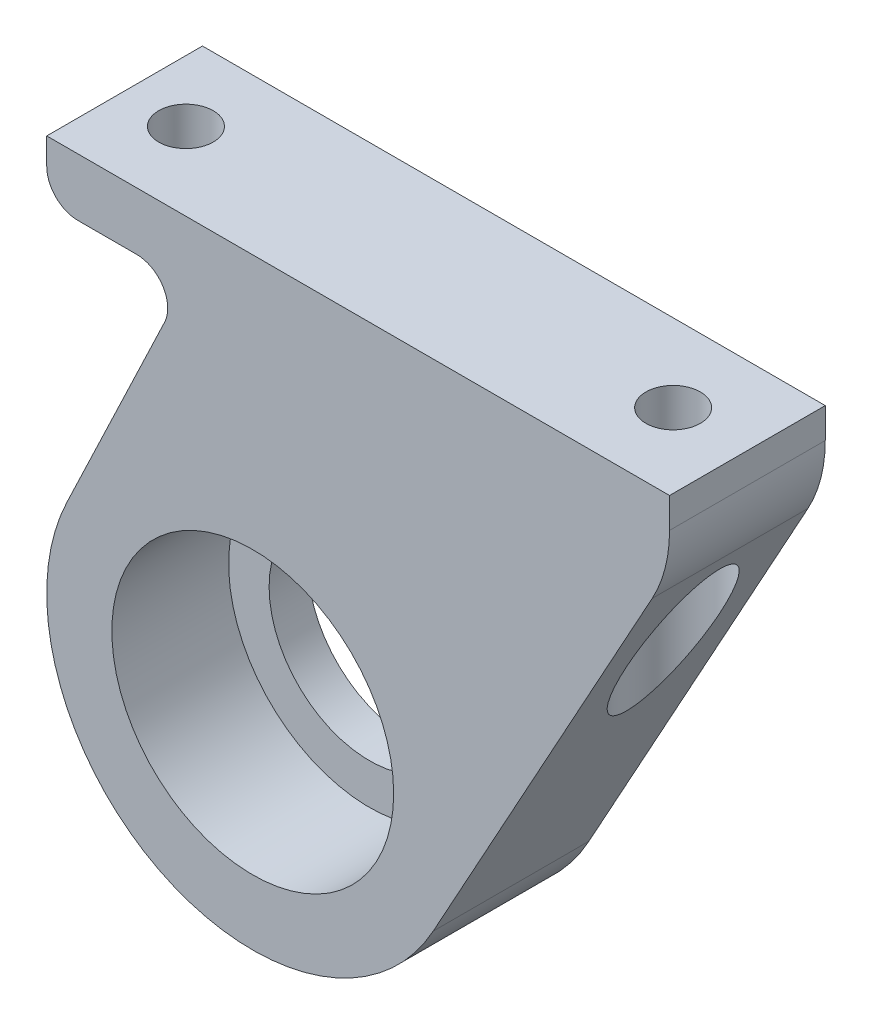
ISO-10303-21;
HEADER;
FILE_DESCRIPTION(('STEP AP214'),'2;1');
FILE_NAME('part.step','',(''),(''),'','','');
FILE_SCHEMA(('AUTOMOTIVE_DESIGN { 1 0 10303 214 1 1 1 1 }'));
ENDSEC;
DATA;
#1=APPLICATION_CONTEXT('core data for automotive mechanical design processes');
#2=APPLICATION_PROTOCOL_DEFINITION('international standard','automotive_design',2000,#1);
#3=PRODUCT_CONTEXT('',#1,'mechanical');
#4=PRODUCT('Part','Part','',(#3));
#5=PRODUCT_RELATED_PRODUCT_CATEGORY('part','',(#4));
#6=PRODUCT_DEFINITION_FORMATION('','',#4);
#7=PRODUCT_DEFINITION_CONTEXT('part definition',#1,'design');
#8=PRODUCT_DEFINITION('design','',#6,#7);
#9=PRODUCT_DEFINITION_SHAPE('','',#8);
#10=(LENGTH_UNIT() NAMED_UNIT(*) SI_UNIT(.MILLI.,.METRE.));
#11=(NAMED_UNIT(*) PLANE_ANGLE_UNIT() SI_UNIT($,.RADIAN.));
#12=(NAMED_UNIT(*) SI_UNIT($,.STERADIAN.) SOLID_ANGLE_UNIT());
#13=UNCERTAINTY_MEASURE_WITH_UNIT(LENGTH_MEASURE(1.E-05),#10,'distance_accuracy_value','');
#14=(GEOMETRIC_REPRESENTATION_CONTEXT(3) GLOBAL_UNCERTAINTY_ASSIGNED_CONTEXT((#13)) GLOBAL_UNIT_ASSIGNED_CONTEXT((#10,
#11,#12)) REPRESENTATION_CONTEXT('',''));
#15=CARTESIAN_POINT('',(0.,0.,0.));
#16=DIRECTION('',(0.,0.,1.));
#17=DIRECTION('',(1.,0.,0.));
#18=AXIS2_PLACEMENT_3D('',#15,#16,#17);
#19=CARTESIAN_POINT('',(-20.423245911174,18.3245528808047,10.));
#20=DIRECTION('',(0.,0.,1.));
#21=DIRECTION('',(-1.,0.,0.));
#22=AXIS2_PLACEMENT_3D('',#19,#20,#21);
#23=CYLINDRICAL_SURFACE('',#22,2.);
#24=CARTESIAN_POINT('',(-20.4232459111739,16.3245528808047,12.7127607788059));
#25=CARTESIAN_POINT('',(-20.4887695492939,16.3245611442696,12.7683597231879));
#26=CARTESIAN_POINT('',(-20.551782925905,16.3277700807168,12.8266988335914));
#27=CARTESIAN_POINT('',(-20.6722658688388,16.3391942056474,12.9481927882589));
#28=CARTESIAN_POINT('',(-20.7297457982924,16.3473998163829,13.0113382175279));
#29=CARTESIAN_POINT('',(-20.8929254544888,16.3773502421294,13.2066801127024));
#30=CARTESIAN_POINT('',(-20.990019498793,16.404456252849,13.3453421223078));
#31=CARTESIAN_POINT('',(-21.1493133231444,16.4593263762254,13.6189108915641));
#32=CARTESIAN_POINT('',(-21.2142721504513,16.4866392343981,13.752345741235));
#33=CARTESIAN_POINT('',(-21.3240672508794,16.5378766477722,14.0281588711045));
#34=CARTESIAN_POINT('',(-21.3688910002988,16.5617990878733,14.1705426548211));
#35=CARTESIAN_POINT('',(-21.422374733152,16.5918592511803,14.398908707465));
#36=CARTESIAN_POINT('',(-21.4382973581837,16.601221299669,14.4828205669503));
#37=CARTESIAN_POINT('',(-21.4629547439993,16.6159811711615,14.6520671201811));
#38=CARTESIAN_POINT('',(-21.4716895825385,16.6213790370486,14.7374017985248));
#39=CARTESIAN_POINT('',(-21.4818035637808,16.6276465166273,14.9085526407736));
#40=CARTESIAN_POINT('',(-21.4831929708175,16.6285224491222,14.9943679649659));
#41=CARTESIAN_POINT('',(-21.4786189332838,16.6256722751133,15.1657191879824));
#42=CARTESIAN_POINT('',(-21.4726561490108,16.6219465818797,15.2512551112077));
#43=CARTESIAN_POINT('',(-21.4548800024892,16.6111295588673,15.4088726482311));
#44=CARTESIAN_POINT('',(-21.4440407518192,16.6046048197193,15.4811061295419));
#45=CARTESIAN_POINT('',(-21.4171956758794,16.5889540710241,15.6243297681613));
#46=CARTESIAN_POINT('',(-21.4011880497648,16.5798271549163,15.6953194829948));
#47=CARTESIAN_POINT('',(-21.3455594083571,16.5494077073409,15.9060890047494));
#48=CARTESIAN_POINT('',(-21.2983529040815,16.525091153502,16.04349297466));
#49=CARTESIAN_POINT('',(-21.1796357220324,16.4718577610889,16.3219978062562));
#50=CARTESIAN_POINT('',(-21.1062763295459,16.4427234273619,16.4622586878048));
#51=CARTESIAN_POINT('',(-20.9379945901458,16.3899277771758,16.7299692585138));
#52=CARTESIAN_POINT('',(-20.8431428578687,16.3662490386409,16.8574589730392));
#53=CARTESIAN_POINT('',(-20.6899188983205,16.3418053319268,17.0323352088572));
#54=CARTESIAN_POINT('',(-20.6393779675668,16.3355665416617,17.0859134994434));
#55=CARTESIAN_POINT('',(-20.534258657173,16.3269396309748,17.1894252270111));
#56=CARTESIAN_POINT('',(-20.479674782226,16.3245568560844,17.2393535127164));
#57=CARTESIAN_POINT('',(-20.4232459111739,16.3245528808047,17.2872392211941));
#58=B_SPLINE_CURVE_WITH_KNOTS('',3,(#24,#25,#26,#27,#28,#29,#30,#31,#32,#33,#34,#35,#36,#37,#38,
#39,#40,#41,#42,#43,#44,#45,#46,#47,#48,#49,#50,#51,#52,#53,#54,#55,#56,#57),.UNSPECIFIED.,.F.,
.F.,(4,2,2,2,2,2,2,2,2,2,2,2,2,2,2,2,4),(0.,0.257437488815616,0.514383061708198,
1.02573296584412,1.47702144076985,1.92859022268281,2.18600973356861,2.44342645973293,
2.70048338254542,2.95751722085984,3.1772672420411,3.39709391467932,3.83727529526278,
4.31830047479043,4.79776755690636,5.01925937750807,5.24105798640268),.UNSPECIFIED.);
#59=CARTESIAN_POINT('',(-20.4232459111739,16.3245528808047,12.7127607788059));
#60=VERTEX_POINT('',#59);
#61=CARTESIAN_POINT('',(-20.4232459111739,16.3245528808047,17.2872392211941));
#62=VERTEX_POINT('',#61);
#63=EDGE_CURVE('E174',#60,#62,#58,.T.);
#64=ORIENTED_EDGE('',*,*,#63,.T.);
#65=DIRECTION('',(0.,0.,1.));
#66=VECTOR('',#65,1.);
#67=CARTESIAN_POINT('',(-20.4232459111739,16.3245528808047,10.));
#68=LINE('',#67,#66);
#69=CARTESIAN_POINT('',(-20.4232459111739,16.3245528808047,20.));
#70=VERTEX_POINT('',#69);
#71=EDGE_CURVE('E177',#62,#70,#68,.T.);
#72=ORIENTED_EDGE('',*,*,#71,.T.);
#73=CARTESIAN_POINT('',(-20.423245911174,18.3245528808047,20.));
#74=DIRECTION('',(0.,0.,1.));
#75=DIRECTION('',(1.,0.,0.));
#76=AXIS2_PLACEMENT_3D('',#73,#74,#75);
#77=CIRCLE('',#76,2.);
#78=CARTESIAN_POINT('',(-22.423245911174,18.3245528808047,20.));
#79=VERTEX_POINT('',#78);
#80=EDGE_CURVE('E201',#79,#70,#77,.T.);
#81=ORIENTED_EDGE('',*,*,#80,.F.);
#82=DIRECTION('',(0.,0.,1.));
#83=VECTOR('',#82,1.);
#84=CARTESIAN_POINT('',(-22.423245911174,18.3245528808047,10.));
#85=LINE('',#84,#83);
#86=CARTESIAN_POINT('',(-22.423245911174,18.3245528808047,10.));
#87=VERTEX_POINT('',#86);
#88=EDGE_CURVE('E230',#87,#79,#85,.T.);
#89=ORIENTED_EDGE('',*,*,#88,.F.);
#90=CARTESIAN_POINT('',(-20.423245911174,18.3245528808047,10.));
#91=DIRECTION('',(0.,0.,1.));
#92=DIRECTION('',(1.,0.,0.));
#93=AXIS2_PLACEMENT_3D('',#90,#91,#92);
#94=CIRCLE('',#93,2.);
#95=CARTESIAN_POINT('',(-20.4232459111739,16.3245528808047,10.));
#96=VERTEX_POINT('',#95);
#97=EDGE_CURVE('E202',#87,#96,#94,.T.);
#98=ORIENTED_EDGE('',*,*,#97,.T.);
#99=EDGE_CURVE('E144',#96,#60,#68,.T.);
#100=ORIENTED_EDGE('',*,*,#99,.T.);
#101=EDGE_LOOP('',(#64,#72,#81,#89,#98,#100));
#102=FACE_BOUND('',#101,.T.);
#103=ADVANCED_FACE('F43',(#102),#23,.T.);
#104=CARTESIAN_POINT('',(-20.4232459111739,16.3245528808047,10.));
#105=DIRECTION('',(0.,1.,0.));
#106=DIRECTION('',(0.,0.,-1.));
#107=AXIS2_PLACEMENT_3D('',#104,#105,#106);
#108=PLANE('',#107);
#109=CARTESIAN_POINT('',(-18.481973971174,16.3245528808047,15.));
#110=DIRECTION('',(0.,-1.,0.));
#111=DIRECTION('',(0.,0.,-1.));
#112=AXIS2_PLACEMENT_3D('',#109,#110,#111);
#113=CIRCLE('',#112,3.);
#114=CARTESIAN_POINT('',(-16.6518746680662,16.3245528808047,17.3771277922662));
#115=VERTEX_POINT('',#114);
#116=EDGE_CURVE('E181',#62,#115,#113,.F.);
#117=ORIENTED_EDGE('',*,*,#116,.T.);
#118=DIRECTION('',(0.,0.,1.));
#119=VECTOR('',#118,1.);
#120=CARTESIAN_POINT('',(-16.6518746680662,16.3245528808047,10.));
#121=LINE('',#120,#119);
#122=CARTESIAN_POINT('',(-16.6518746680662,16.3245528808047,20.));
#123=VERTEX_POINT('',#122);
#124=EDGE_CURVE('E276',#115,#123,#121,.T.);
#125=ORIENTED_EDGE('',*,*,#124,.T.);
#126=DIRECTION('',(1.,0.,0.));
#127=VECTOR('',#126,1.);
#128=CARTESIAN_POINT('',(-20.4232459111739,16.3245528808047,20.));
#129=LINE('',#128,#127);
#130=EDGE_CURVE('E233',#70,#123,#129,.T.);
#131=ORIENTED_EDGE('',*,*,#130,.F.);
#132=ORIENTED_EDGE('',*,*,#71,.F.);
#133=EDGE_LOOP('',(#117,#125,#131,#132));
#134=FACE_BOUND('',#133,.T.);
#135=ADVANCED_FACE('F162',(#134),#108,.F.);
#136=CARTESIAN_POINT('',(-16.6518746680662,14.3245528808047,10.));
#137=DIRECTION('',(0.,0.,1.));
#138=DIRECTION('',(-1.,0.,0.));
#139=AXIS2_PLACEMENT_3D('',#136,#137,#138);
#140=CYLINDRICAL_SURFACE('',#139,2.);
#141=CARTESIAN_POINT('',(-16.6518746680662,16.3245528808047,17.3771277922662));
#142=CARTESIAN_POINT('',(-16.5835636770514,16.324549643518,17.3245637448121));
#143=CARTESIAN_POINT('',(-16.5176343482555,16.3210561128765,17.2690928528414));
#144=CARTESIAN_POINT('',(-16.3911842158571,16.3085056162088,17.1531154102551));
#145=CARTESIAN_POINT('',(-16.3306517364897,16.2994610114274,17.0926203057471));
#146=CARTESIAN_POINT('',(-16.2157149457288,16.2772867450315,16.9675491414749));
#147=CARTESIAN_POINT('',(-16.1612726893345,16.2641845460208,16.9030027756789));
#148=CARTESIAN_POINT('',(-16.0582682598351,16.2351799310674,16.7699527488741));
#149=CARTESIAN_POINT('',(-16.0097088683158,16.2192761991344,16.7014472383055));
#150=CARTESIAN_POINT('',(-15.8862101458836,16.1740522757982,16.5108159523191));
#151=CARTESIAN_POINT('',(-15.8170870644824,16.1432379557405,16.3852223905426));
#152=CARTESIAN_POINT('',(-15.6972166485052,16.0832808890627,16.1250321531221));
#153=CARTESIAN_POINT('',(-15.6464918832367,16.054140232149,15.9904246580971));
#154=CARTESIAN_POINT('',(-15.565086491734,16.0041912388377,15.715520813009));
#155=CARTESIAN_POINT('',(-15.5341553189924,15.9832800955908,15.5753204538014));
#156=CARTESIAN_POINT('',(-15.5030296953724,15.9617141302766,15.3620279852604));
#157=CARTESIAN_POINT('',(-15.495199805572,15.9561593368413,15.2904760685281));
#158=CARTESIAN_POINT('',(-15.4847028585106,15.9486700999029,15.1467905643391));
#159=CARTESIAN_POINT('',(-15.482035611577,15.9467355233952,15.0746569983496));
#160=CARTESIAN_POINT('',(-15.4819143369453,15.9466480971483,14.9302512757359));
#161=CARTESIAN_POINT('',(-15.4844698336752,15.9485021565335,14.8579791064676));
#162=CARTESIAN_POINT('',(-15.4947639116706,15.9558497205583,14.7140068974948));
#163=CARTESIAN_POINT('',(-15.5025026983006,15.9613433694003,14.6423068805731));
#164=CARTESIAN_POINT('',(-15.5333864985258,15.9827590887057,14.4285650149534));
#165=CARTESIAN_POINT('',(-15.5641987401963,16.0036145781758,14.2880546986534));
#166=CARTESIAN_POINT('',(-15.6449776615086,16.053241774724,14.0141217486815));
#167=CARTESIAN_POINT('',(-15.6949740175126,16.0820257269677,13.8807104625782));
#168=CARTESIAN_POINT('',(-15.8130488492405,16.1413444976932,13.6227155518328));
#169=CARTESIAN_POINT('',(-15.8811055211114,16.1718771703556,13.4981215105389));
#170=CARTESIAN_POINT('',(-16.003617730507,16.2172088973466,13.307390352005));
#171=CARTESIAN_POINT('',(-16.0524884622794,16.233387010334,13.2379435660311));
#172=CARTESIAN_POINT('',(-16.1562584780787,16.2629215995418,13.1030861644971));
#173=CARTESIAN_POINT('',(-16.2111549375369,16.2762793892806,13.0376736801215));
#174=CARTESIAN_POINT('',(-16.3271519187017,16.2989055796637,12.9109437020541));
#175=CARTESIAN_POINT('',(-16.3882922118222,16.308145459133,12.8496571906445));
#176=CARTESIAN_POINT('',(-16.5160917523951,16.3209737854072,12.7322051343102));
#177=CARTESIAN_POINT('',(-16.5827632016479,16.3245493679871,12.6760515182708));
#178=CARTESIAN_POINT('',(-16.6518746680662,16.3245528808047,12.6228722077338));
#179=B_SPLINE_CURVE_WITH_KNOTS('',3,(#141,#142,#143,#144,#145,#146,#147,#148,#149,#150,#151,
#152,#153,#154,#155,#156,#157,#158,#159,#160,#161,#162,#163,#164,#165,#166,#167,#168,#169,#170,
#171,#172,#173,#174,#175,#176,#177,#178),.UNSPECIFIED.,.F.,.F.,(4,2,2,2,2,2,2,2,2,2,2,2,2,2,2,2,
2,2,4),(0.,0.258265733289105,0.515958431416804,0.771943784965977,1.02804970714106,
1.46639445313713,1.90527511463488,2.33848441808796,2.55482724017938,2.77116211380854,
2.98789185737172,3.20463018838471,3.63861991957701,4.07328372410993,4.50742513653102,
4.76647032614446,5.0253946023537,5.28608536273293,5.54736733528842),.UNSPECIFIED.);
#180=CARTESIAN_POINT('',(-16.6518746680662,16.3245528808047,12.6228722077338));
#181=VERTEX_POINT('',#180);
#182=EDGE_CURVE('E60',#115,#181,#179,.T.);
#183=ORIENTED_EDGE('',*,*,#182,.T.);
#184=CARTESIAN_POINT('',(-16.6518746680662,16.3245528808047,10.));
#185=VERTEX_POINT('',#184);
#186=EDGE_CURVE('E277',#185,#181,#121,.T.);
#187=ORIENTED_EDGE('',*,*,#186,.F.);
#188=CARTESIAN_POINT('',(-16.6518746680662,14.3245528808047,10.));
#189=DIRECTION('',(0.,0.,-1.));
#190=DIRECTION('',(-1.,0.,0.));
#191=AXIS2_PLACEMENT_3D('',#188,#189,#190);
#192=CIRCLE('',#191,2.);
#193=CARTESIAN_POINT('',(-14.846773288379,13.4633856444032,10.));
#194=VERTEX_POINT('',#193);
#195=EDGE_CURVE('E207',#185,#194,#192,.T.);
#196=ORIENTED_EDGE('',*,*,#195,.T.);
#197=DIRECTION('',(0.,0.,1.));
#198=VECTOR('',#197,1.);
#199=CARTESIAN_POINT('',(-14.846773288379,13.4633856444032,10.));
#200=LINE('',#199,#198);
#201=CARTESIAN_POINT('',(-14.846773288379,13.4633856444032,20.));
#202=VERTEX_POINT('',#201);
#203=EDGE_CURVE('E273',#194,#202,#200,.T.);
#204=ORIENTED_EDGE('',*,*,#203,.T.);
#205=CARTESIAN_POINT('',(-16.6518746680662,14.3245528808047,20.));
#206=DIRECTION('',(0.,0.,-1.));
#207=DIRECTION('',(-1.,0.,0.));
#208=AXIS2_PLACEMENT_3D('',#205,#206,#207);
#209=CIRCLE('',#208,2.);
#210=EDGE_CURVE('E236',#123,#202,#209,.T.);
#211=ORIENTED_EDGE('',*,*,#210,.F.);
#212=ORIENTED_EDGE('',*,*,#124,.F.);
#213=EDGE_LOOP('',(#183,#187,#196,#204,#211,#212));
#214=FACE_BOUND('',#213,.T.);
#215=ADVANCED_FACE('F167',(#214),#140,.F.);
#216=CARTESIAN_POINT('',(-21.1339262047569,0.284820641068237,10.));
#217=DIRECTION('',(0.902550689843615,-0.430583618200709,0.));
#218=DIRECTION('',(0.430583618200709,0.902550689843615,0.));
#219=AXIS2_PLACEMENT_3D('',#216,#217,#218);
#220=PLANE('',#219);
#221=DIRECTION('',(-0.430583618200709,-0.902550689843615,0.));
#222=VECTOR('',#221,1.);
#223=CARTESIAN_POINT('',(-21.1339262047569,0.284820641068237,20.));
#224=LINE('',#223,#222);
#225=CARTESIAN_POINT('',(-21.1339262047569,0.284820641068232,20.));
#226=VERTEX_POINT('',#225);
#227=EDGE_CURVE('E239',#202,#226,#224,.T.);
#228=ORIENTED_EDGE('',*,*,#227,.F.);
#229=ORIENTED_EDGE('',*,*,#203,.F.);
#230=DIRECTION('',(-0.430583618200709,-0.902550689843615,0.));
#231=VECTOR('',#230,1.);
#232=CARTESIAN_POINT('',(-21.1339262047569,0.284820641068237,10.));
#233=LINE('',#232,#231);
#234=CARTESIAN_POINT('',(-21.1339262047569,0.284820641068232,10.));
#235=VERTEX_POINT('',#234);
#236=EDGE_CURVE('E210',#194,#235,#233,.T.);
#237=ORIENTED_EDGE('',*,*,#236,.T.);
#238=DIRECTION('',(0.,0.,1.));
#239=VECTOR('',#238,1.);
#240=CARTESIAN_POINT('',(-21.1339262047569,0.284820641068232,10.));
#241=LINE('',#240,#239);
#242=EDGE_CURVE('E270',#235,#226,#241,.T.);
#243=ORIENTED_EDGE('',*,*,#242,.T.);
#244=EDGE_LOOP('',(#228,#229,#237,#243));
#245=FACE_BOUND('',#244,.T.);
#246=CARTESIAN_POINT('',(-18.481973971174,5.84360461862522,15.));
#247=DIRECTION('',(-0.902550689843615,0.430583618200709,0.));
#248=DIRECTION('',(0.43058361820071,0.902550689843615,0.));
#249=AXIS2_PLACEMENT_3D('',#246,#247,#248);
#250=ELLIPSE('',#249,6.96728782329475,3.);
#251=CARTESIAN_POINT('',(-18.7296001464338,5.32455288080469,12.0102372540072));
#252=VERTEX_POINT('',#251);
#253=CARTESIAN_POINT('',(-18.7296001464338,5.32455288080469,17.9897627459928));
#254=VERTEX_POINT('',#253);
#255=EDGE_CURVE('E11',#252,#254,#250,.F.);
#256=ORIENTED_EDGE('',*,*,#255,.T.);
#257=DIRECTION('',(0.,0.,1.));
#258=VECTOR('',#257,1.);
#259=CARTESIAN_POINT('',(-18.7296001464338,5.32455288080469,10.));
#260=LINE('',#259,#258);
#261=EDGE_CURVE('E52',#252,#254,#260,.T.);
#262=ORIENTED_EDGE('',*,*,#261,.F.);
#263=EDGE_LOOP('',(#256,#262));
#264=FACE_BOUND('',#263,.T.);
#265=ADVANCED_FACE('F143',(#245,#264),#220,.F.);
#266=CARTESIAN_POINT('',(-9.19257548007548,-5.41208930437528,10.));
#267=DIRECTION('',(0.,0.,1.));
#268=DIRECTION('',(-1.,0.,0.));
#269=AXIS2_PLACEMENT_3D('',#266,#267,#268);
#270=CYLINDRICAL_SURFACE('',#269,9.05);
#271=CARTESIAN_POINT('',(-9.19257548007548,-5.41208930437528,20.));
#272=DIRECTION('',(0.,0.,1.));
#273=DIRECTION('',(1.,0.,0.));
#274=AXIS2_PLACEMENT_3D('',#271,#272,#273);
#275=CIRCLE('',#274,9.05);
#276=CARTESIAN_POINT('',(-0.142575480075477,-5.41208930437528,20.));
#277=VERTEX_POINT('',#276);
#278=EDGE_CURVE('E198',#277,#277,#275,.T.);
#279=ORIENTED_EDGE('',*,*,#278,.T.);
#280=EDGE_LOOP('',(#279));
#281=FACE_BOUND('',#280,.T.);
#282=CARTESIAN_POINT('',(-9.19257548007548,-5.41208930437528,12.5));
#283=DIRECTION('',(0.,0.,1.));
#284=DIRECTION('',(1.,0.,0.));
#285=AXIS2_PLACEMENT_3D('',#282,#283,#284);
#286=CIRCLE('',#285,9.05);
#287=CARTESIAN_POINT('',(-0.142575480075477,-5.41208930437528,12.5));
#288=VERTEX_POINT('',#287);
#289=EDGE_CURVE('E196',#288,#288,#286,.T.);
#290=ORIENTED_EDGE('',*,*,#289,.F.);
#291=EDGE_LOOP('',(#290));
#292=FACE_BOUND('',#291,.T.);
#293=ADVANCED_FACE('F504',(#281,#292),#270,.F.);
#294=CARTESIAN_POINT('',(-20.423245911174,18.3245528808047,10.));
#295=DIRECTION('',(0.,0.,-1.));
#296=DIRECTION('',(1.,0.,0.));
#297=AXIS2_PLACEMENT_3D('',#294,#295,#296);
#298=PLANE('',#297);
#299=ORIENTED_EDGE('',*,*,#97,.F.);
#300=DIRECTION('',(0.,-1.,0.));
#301=VECTOR('',#300,1.);
#302=CARTESIAN_POINT('',(-22.423245911174,18.3245528808047,10.));
#303=LINE('',#302,#301);
#304=CARTESIAN_POINT('',(-22.423245911174,20.0279106956247,10.));
#305=VERTEX_POINT('',#304);
#306=EDGE_CURVE('E228',#305,#87,#303,.T.);
#307=ORIENTED_EDGE('',*,*,#306,.F.);
#308=DIRECTION('',(-1.,0.,0.));
#309=VECTOR('',#308,1.);
#310=CARTESIAN_POINT('',(17.576754088826,20.0279106956247,10.));
#311=LINE('',#310,#309);
#312=CARTESIAN_POINT('',(17.576754088826,20.0279106956247,10.));
#313=VERTEX_POINT('',#312);
#314=EDGE_CURVE('E225',#313,#305,#311,.T.);
#315=ORIENTED_EDGE('',*,*,#314,.F.);
#316=DIRECTION('',(0.,1.,0.));
#317=VECTOR('',#316,1.);
#318=CARTESIAN_POINT('',(17.576754088826,18.0857528469733,10.));
#319=LINE('',#318,#317);
#320=CARTESIAN_POINT('',(17.576754088826,18.0857528469733,10.));
#321=VERTEX_POINT('',#320);
#322=EDGE_CURVE('E222',#321,#313,#319,.T.);
#323=ORIENTED_EDGE('',*,*,#322,.F.);
#324=CARTESIAN_POINT('',(8.57675408882604,18.0857528469733,10.));
#325=DIRECTION('',(0.,0.,1.));
#326=DIRECTION('',(1.,0.,0.));
#327=AXIS2_PLACEMENT_3D('',#324,#325,#326);
#328=CIRCLE('',#327,9.);
#329=CARTESIAN_POINT('',(16.4604574675479,13.7444142243445,10.));
#330=VERTEX_POINT('',#329);
#331=EDGE_CURVE('E219',#330,#321,#328,.T.);
#332=ORIENTED_EDGE('',*,*,#331,.F.);
#333=DIRECTION('',(0.482370958069871,0.875967042080211,0.));
#334=VECTOR('',#333,1.);
#335=CARTESIAN_POINT('',(2.39705576219197,-11.7941804761309,10.));
#336=LINE('',#335,#334);
#337=CARTESIAN_POINT('',(2.39705576219197,-11.7941804761309,10.));
#338=VERTEX_POINT('',#337);
#339=EDGE_CURVE('E216',#338,#330,#336,.T.);
#340=ORIENTED_EDGE('',*,*,#339,.F.);
#341=CARTESIAN_POINT('',(-9.19257548007548,-5.41208930437528,10.));
#342=DIRECTION('',(0.,0.,1.));
#343=DIRECTION('',(1.,0.,0.));
#344=AXIS2_PLACEMENT_3D('',#341,#342,#343);
#345=CIRCLE('',#344,13.2306704310985);
#346=EDGE_CURVE('E213',#235,#338,#345,.T.);
#347=ORIENTED_EDGE('',*,*,#346,.F.);
#348=ORIENTED_EDGE('',*,*,#236,.F.);
#349=ORIENTED_EDGE('',*,*,#195,.F.);
#350=DIRECTION('',(1.,0.,0.));
#351=VECTOR('',#350,1.);
#352=CARTESIAN_POINT('',(-20.4232459111739,16.3245528808047,10.));
#353=LINE('',#352,#351);
#354=EDGE_CURVE('E204',#96,#185,#353,.T.);
#355=ORIENTED_EDGE('',*,*,#354,.F.);
#356=EDGE_LOOP('',(#299,#307,#315,#323,#332,#340,#347,#348,#349,#355));
#357=FACE_BOUND('',#356,.T.);
#358=CARTESIAN_POINT('',(-9.19257548007548,-5.41208930437528,10.));
#359=DIRECTION('',(0.,0.,1.));
#360=DIRECTION('',(1.,0.,0.));
#361=AXIS2_PLACEMENT_3D('',#358,#359,#360);
#362=CIRCLE('',#361,6.45);
#363=CARTESIAN_POINT('',(-2.74257548007547,-5.41208930437528,10.));
#364=VERTEX_POINT('',#363);
#365=EDGE_CURVE('E180',#364,#364,#362,.T.);
#366=ORIENTED_EDGE('',*,*,#365,.T.);
#367=EDGE_LOOP('',(#366));
#368=FACE_BOUND('',#367,.T.);
#369=ADVANCED_FACE('F323',(#357,#368),#298,.T.);
#370=CARTESIAN_POINT('',(-20.423245911174,18.3245528808047,20.));
#371=DIRECTION('',(0.,0.,-1.));
#372=DIRECTION('',(1.,0.,0.));
#373=AXIS2_PLACEMENT_3D('',#370,#371,#372);
#374=PLANE('',#373);
#375=ORIENTED_EDGE('',*,*,#80,.T.);
#376=ORIENTED_EDGE('',*,*,#130,.T.);
#377=ORIENTED_EDGE('',*,*,#210,.T.);
#378=ORIENTED_EDGE('',*,*,#227,.T.);
#379=CARTESIAN_POINT('',(-9.19257548007548,-5.41208930437528,20.));
#380=DIRECTION('',(0.,0.,1.));
#381=DIRECTION('',(1.,0.,0.));
#382=AXIS2_PLACEMENT_3D('',#379,#380,#381);
#383=CIRCLE('',#382,13.2306704310985);
#384=CARTESIAN_POINT('',(2.39705576219197,-11.7941804761309,20.));
#385=VERTEX_POINT('',#384);
#386=EDGE_CURVE('E242',#226,#385,#383,.T.);
#387=ORIENTED_EDGE('',*,*,#386,.T.);
#388=DIRECTION('',(0.482370958069871,0.875967042080211,0.));
#389=VECTOR('',#388,1.);
#390=CARTESIAN_POINT('',(2.39705576219197,-11.7941804761309,20.));
#391=LINE('',#390,#389);
#392=CARTESIAN_POINT('',(16.4604574675479,13.7444142243445,20.));
#393=VERTEX_POINT('',#392);
#394=EDGE_CURVE('E245',#385,#393,#391,.T.);
#395=ORIENTED_EDGE('',*,*,#394,.T.);
#396=CARTESIAN_POINT('',(8.57675408882604,18.0857528469733,20.));
#397=DIRECTION('',(0.,0.,1.));
#398=DIRECTION('',(1.,0.,0.));
#399=AXIS2_PLACEMENT_3D('',#396,#397,#398);
#400=CIRCLE('',#399,9.);
#401=CARTESIAN_POINT('',(17.576754088826,18.0857528469733,20.));
#402=VERTEX_POINT('',#401);
#403=EDGE_CURVE('E248',#393,#402,#400,.T.);
#404=ORIENTED_EDGE('',*,*,#403,.T.);
#405=DIRECTION('',(0.,1.,0.));
#406=VECTOR('',#405,1.);
#407=CARTESIAN_POINT('',(17.576754088826,18.0857528469733,20.));
#408=LINE('',#407,#406);
#409=CARTESIAN_POINT('',(17.576754088826,20.0279106956247,20.));
#410=VERTEX_POINT('',#409);
#411=EDGE_CURVE('E251',#402,#410,#408,.T.);
#412=ORIENTED_EDGE('',*,*,#411,.T.);
#413=DIRECTION('',(-1.,0.,0.));
#414=VECTOR('',#413,1.);
#415=CARTESIAN_POINT('',(17.576754088826,20.0279106956247,20.));
#416=LINE('',#415,#414);
#417=CARTESIAN_POINT('',(-22.423245911174,20.0279106956247,20.));
#418=VERTEX_POINT('',#417);
#419=EDGE_CURVE('E254',#410,#418,#416,.T.);
#420=ORIENTED_EDGE('',*,*,#419,.T.);
#421=DIRECTION('',(0.,-1.,0.));
#422=VECTOR('',#421,1.);
#423=CARTESIAN_POINT('',(-22.423245911174,18.3245528808047,20.));
#424=LINE('',#423,#422);
#425=EDGE_CURVE('E205',#418,#79,#424,.T.);
#426=ORIENTED_EDGE('',*,*,#425,.T.);
#427=EDGE_LOOP('',(#375,#376,#377,#378,#387,#395,#404,#412,#420,#426));
#428=FACE_BOUND('',#427,.T.);
#429=ORIENTED_EDGE('',*,*,#278,.F.);
#430=EDGE_LOOP('',(#429));
#431=FACE_BOUND('',#430,.T.);
#432=ADVANCED_FACE('F315',(#428,#431),#374,.F.);
#433=EDGE_CURVE('E187',#181,#60,#113,.F.);
#434=ORIENTED_EDGE('',*,*,#433,.T.);
#435=ORIENTED_EDGE('',*,*,#99,.F.);
#436=ORIENTED_EDGE('',*,*,#354,.T.);
#437=ORIENTED_EDGE('',*,*,#186,.T.);
#438=EDGE_LOOP('',(#434,#435,#436,#437));
#439=FACE_BOUND('',#438,.T.);
#440=ADVANCED_FACE('F169',(#439),#108,.F.);
#441=CARTESIAN_POINT('',(-9.19257548007548,-5.41208930437528,10.));
#442=DIRECTION('',(0.,0.,1.));
#443=DIRECTION('',(-1.,0.,0.));
#444=AXIS2_PLACEMENT_3D('',#441,#442,#443);
#445=CYLINDRICAL_SURFACE('',#444,13.2306704310985);
#446=ORIENTED_EDGE('',*,*,#386,.F.);
#447=ORIENTED_EDGE('',*,*,#242,.F.);
#448=ORIENTED_EDGE('',*,*,#346,.T.);
#449=DIRECTION('',(0.,0.,1.));
#450=VECTOR('',#449,1.);
#451=CARTESIAN_POINT('',(2.39705576219197,-11.7941804761309,10.));
#452=LINE('',#451,#450);
#453=EDGE_CURVE('E268',#338,#385,#452,.T.);
#454=ORIENTED_EDGE('',*,*,#453,.T.);
#455=EDGE_LOOP('',(#446,#447,#448,#454));
#456=FACE_BOUND('',#455,.T.);
#457=ADVANCED_FACE('F314',(#456),#445,.T.);
#458=CARTESIAN_POINT('',(2.39705576219197,-11.7941804761309,10.));
#459=DIRECTION('',(-0.875967042080211,0.482370958069871,0.));
#460=DIRECTION('',(-0.482370958069872,-0.875967042080211,0.));
#461=AXIS2_PLACEMENT_3D('',#458,#459,#460);
#462=PLANE('',#461);
#463=CARTESIAN_POINT('',(12.806754088826,7.10942990832374,15.));
#464=DIRECTION('',(0.875967042080211,-0.482370958069871,0.));
#465=DIRECTION('',(0.482370958069872,0.875967042080211,0.));
#466=AXIS2_PLACEMENT_3D('',#463,#464,#465);
#467=ELLIPSE('',#466,6.21927989198192,3.);
#468=CARTESIAN_POINT('',(15.8067540888261,12.5573141191721,15.));
#469=VERTEX_POINT('',#468);
#470=EDGE_CURVE('E47',#469,#469,#467,.T.);
#471=ORIENTED_EDGE('',*,*,#470,.F.);
#472=EDGE_LOOP('',(#471));
#473=FACE_BOUND('',#472,.T.);
#474=ORIENTED_EDGE('',*,*,#394,.F.);
#475=ORIENTED_EDGE('',*,*,#453,.F.);
#476=ORIENTED_EDGE('',*,*,#339,.T.);
#477=DIRECTION('',(0.,0.,1.));
#478=VECTOR('',#477,1.);
#479=CARTESIAN_POINT('',(16.4604574675479,13.7444142243445,10.));
#480=LINE('',#479,#478);
#481=EDGE_CURVE('E266',#330,#393,#480,.T.);
#482=ORIENTED_EDGE('',*,*,#481,.T.);
#483=EDGE_LOOP('',(#474,#475,#476,#482));
#484=FACE_BOUND('',#483,.T.);
#485=ADVANCED_FACE('F321',(#473,#484),#462,.F.);
#486=CARTESIAN_POINT('',(8.57675408882604,18.0857528469733,10.));
#487=DIRECTION('',(0.,0.,1.));
#488=DIRECTION('',(-1.,0.,0.));
#489=AXIS2_PLACEMENT_3D('',#486,#487,#488);
#490=CYLINDRICAL_SURFACE('',#489,9.);
#491=ORIENTED_EDGE('',*,*,#403,.F.);
#492=ORIENTED_EDGE('',*,*,#481,.F.);
#493=ORIENTED_EDGE('',*,*,#331,.T.);
#494=DIRECTION('',(0.,0.,1.));
#495=VECTOR('',#494,1.);
#496=CARTESIAN_POINT('',(17.576754088826,18.0857528469733,10.));
#497=LINE('',#496,#495);
#498=EDGE_CURVE('E264',#321,#402,#497,.T.);
#499=ORIENTED_EDGE('',*,*,#498,.T.);
#500=EDGE_LOOP('',(#491,#492,#493,#499));
#501=FACE_BOUND('',#500,.T.);
#502=ADVANCED_FACE('F348',(#501),#490,.T.);
#503=CARTESIAN_POINT('',(17.576754088826,18.0857528469733,10.));
#504=DIRECTION('',(-1.,0.,0.));
#505=DIRECTION('',(0.,0.,-1.));
#506=AXIS2_PLACEMENT_3D('',#503,#504,#505);
#507=PLANE('',#506);
#508=ORIENTED_EDGE('',*,*,#411,.F.);
#509=ORIENTED_EDGE('',*,*,#498,.F.);
#510=ORIENTED_EDGE('',*,*,#322,.T.);
#511=DIRECTION('',(0.,0.,1.));
#512=VECTOR('',#511,1.);
#513=CARTESIAN_POINT('',(17.576754088826,20.0279106956247,10.));
#514=LINE('',#513,#512);
#515=EDGE_CURVE('E262',#313,#410,#514,.T.);
#516=ORIENTED_EDGE('',*,*,#515,.T.);
#517=EDGE_LOOP('',(#508,#509,#510,#516));
#518=FACE_BOUND('',#517,.T.);
#519=ADVANCED_FACE('F352',(#518),#507,.F.);
#520=CARTESIAN_POINT('',(17.576754088826,20.0279106956247,10.));
#521=DIRECTION('',(0.,-1.,0.));
#522=DIRECTION('',(0.,0.,1.));
#523=AXIS2_PLACEMENT_3D('',#520,#521,#522);
#524=PLANE('',#523);
#525=CARTESIAN_POINT('',(-18.481973971174,20.0279106956247,15.));
#526=DIRECTION('',(0.,-1.,0.));
#527=DIRECTION('',(0.,0.,-1.));
#528=AXIS2_PLACEMENT_3D('',#525,#526,#527);
#529=CIRCLE('',#528,1.75);
#530=CARTESIAN_POINT('',(-18.481973971174,20.0279106956247,13.25));
#531=VERTEX_POINT('',#530);
#532=EDGE_CURVE('E285',#531,#531,#529,.T.);
#533=ORIENTED_EDGE('',*,*,#532,.T.);
#534=EDGE_LOOP('',(#533));
#535=FACE_BOUND('',#534,.T.);
#536=CARTESIAN_POINT('',(12.806754088826,20.0279106956247,15.));
#537=DIRECTION('',(0.,-1.,0.));
#538=DIRECTION('',(0.,0.,-1.));
#539=AXIS2_PLACEMENT_3D('',#536,#537,#538);
#540=CIRCLE('',#539,1.75);
#541=CARTESIAN_POINT('',(12.806754088826,20.0279106956247,13.25));
#542=VERTEX_POINT('',#541);
#543=EDGE_CURVE('E292',#542,#542,#540,.T.);
#544=ORIENTED_EDGE('',*,*,#543,.T.);
#545=EDGE_LOOP('',(#544));
#546=FACE_BOUND('',#545,.T.);
#547=ORIENTED_EDGE('',*,*,#419,.F.);
#548=ORIENTED_EDGE('',*,*,#515,.F.);
#549=ORIENTED_EDGE('',*,*,#314,.T.);
#550=DIRECTION('',(0.,0.,1.));
#551=VECTOR('',#550,1.);
#552=CARTESIAN_POINT('',(-22.423245911174,20.0279106956247,10.));
#553=LINE('',#552,#551);
#554=EDGE_CURVE('E260',#305,#418,#553,.T.);
#555=ORIENTED_EDGE('',*,*,#554,.T.);
#556=EDGE_LOOP('',(#547,#548,#549,#555));
#557=FACE_BOUND('',#556,.T.);
#558=ADVANCED_FACE('F355',(#535,#546,#557),#524,.F.);
#559=CARTESIAN_POINT('',(-22.423245911174,18.3245528808047,10.));
#560=DIRECTION('',(1.,0.,0.));
#561=DIRECTION('',(0.,1.,0.));
#562=AXIS2_PLACEMENT_3D('',#559,#560,#561);
#563=PLANE('',#562);
#564=ORIENTED_EDGE('',*,*,#425,.F.);
#565=ORIENTED_EDGE('',*,*,#554,.F.);
#566=ORIENTED_EDGE('',*,*,#306,.T.);
#567=ORIENTED_EDGE('',*,*,#88,.T.);
#568=EDGE_LOOP('',(#564,#565,#566,#567));
#569=FACE_BOUND('',#568,.T.);
#570=ADVANCED_FACE('F334',(#569),#563,.F.);
#571=CARTESIAN_POINT('',(-9.19257548007548,-5.41208930437528,12.5));
#572=DIRECTION('',(0.,0.,-1.));
#573=DIRECTION('',(1.,0.,0.));
#574=AXIS2_PLACEMENT_3D('',#571,#572,#573);
#575=PLANE('',#574);
#576=CARTESIAN_POINT('',(-9.19257548007548,-5.41208930437528,12.5));
#577=DIRECTION('',(0.,0.,1.));
#578=DIRECTION('',(1.,0.,0.));
#579=AXIS2_PLACEMENT_3D('',#576,#577,#578);
#580=CIRCLE('',#579,6.45);
#581=CARTESIAN_POINT('',(-2.74257548007547,-5.41208930437528,12.5));
#582=VERTEX_POINT('',#581);
#583=EDGE_CURVE('E184',#582,#582,#580,.T.);
#584=ORIENTED_EDGE('',*,*,#583,.F.);
#585=EDGE_LOOP('',(#584));
#586=FACE_BOUND('',#585,.T.);
#587=ORIENTED_EDGE('',*,*,#289,.T.);
#588=EDGE_LOOP('',(#587));
#589=FACE_BOUND('',#588,.T.);
#590=ADVANCED_FACE('F363',(#586,#589),#575,.F.);
#591=CARTESIAN_POINT('',(-9.19257548007548,-5.41208930437528,12.5));
#592=DIRECTION('',(0.,0.,-1.));
#593=DIRECTION('',(1.,0.,0.));
#594=AXIS2_PLACEMENT_3D('',#591,#592,#593);
#595=CYLINDRICAL_SURFACE('',#594,6.45);
#596=ORIENTED_EDGE('',*,*,#583,.T.);
#597=EDGE_LOOP('',(#596));
#598=FACE_BOUND('',#597,.T.);
#599=ORIENTED_EDGE('',*,*,#365,.F.);
#600=EDGE_LOOP('',(#599));
#601=FACE_BOUND('',#600,.T.);
#602=ADVANCED_FACE('F156',(#598,#601),#595,.F.);
#603=CARTESIAN_POINT('',(-18.481973971174,5.32455288080469,15.));
#604=DIRECTION('',(0.,-1.,0.));
#605=DIRECTION('',(0.,0.,1.));
#606=AXIS2_PLACEMENT_3D('',#603,#604,#605);
#607=PLANE('',#606);
#608=CARTESIAN_POINT('',(-18.481973971174,5.32455288080469,15.));
#609=DIRECTION('',(0.,1.,0.));
#610=DIRECTION('',(0.,0.,1.));
#611=AXIS2_PLACEMENT_3D('',#608,#609,#610);
#612=CIRCLE('',#611,3.);
#613=EDGE_CURVE('E67',#254,#252,#612,.T.);
#614=ORIENTED_EDGE('',*,*,#613,.T.);
#615=ORIENTED_EDGE('',*,*,#261,.T.);
#616=EDGE_LOOP('',(#614,#615));
#617=FACE_BOUND('',#616,.T.);
#618=ADVANCED_FACE('F139',(#617),#607,.F.);
#619=CARTESIAN_POINT('',(-18.481973971174,5.32455288080469,15.));
#620=DIRECTION('',(0.,1.,0.));
#621=DIRECTION('',(0.,0.,-1.));
#622=AXIS2_PLACEMENT_3D('',#619,#620,#621);
#623=CYLINDRICAL_SURFACE('',#622,3.);
#624=ORIENTED_EDGE('',*,*,#255,.F.);
#625=ORIENTED_EDGE('',*,*,#613,.F.);
#626=EDGE_LOOP('',(#624,#625));
#627=FACE_BOUND('',#626,.T.);
#628=ADVANCED_FACE('F146',(#627),#623,.F.);
#629=CARTESIAN_POINT('',(-18.481973971174,17.0245528808047,15.));
#630=DIRECTION('',(0.,1.,0.));
#631=DIRECTION('',(0.,0.,1.));
#632=AXIS2_PLACEMENT_3D('',#629,#630,#631);
#633=CIRCLE('',#632,3.);
#634=CARTESIAN_POINT('',(-18.481973971174,17.0245528808047,18.));
#635=VERTEX_POINT('',#634);
#636=EDGE_CURVE('E140',#635,#635,#633,.T.);
#637=ORIENTED_EDGE('',*,*,#636,.T.);
#638=EDGE_LOOP('',(#637));
#639=FACE_BOUND('',#638,.T.);
#640=ORIENTED_EDGE('',*,*,#63,.F.);
#641=ORIENTED_EDGE('',*,*,#433,.F.);
#642=ORIENTED_EDGE('',*,*,#182,.F.);
#643=ORIENTED_EDGE('',*,*,#116,.F.);
#644=EDGE_LOOP('',(#640,#641,#642,#643));
#645=FACE_BOUND('',#644,.T.);
#646=ADVANCED_FACE('F148',(#639,#645),#623,.F.);
#647=CARTESIAN_POINT('',(-18.481973971174,17.0245528808047,15.));
#648=DIRECTION('',(0.,-1.,0.));
#649=DIRECTION('',(0.,0.,1.));
#650=AXIS2_PLACEMENT_3D('',#647,#648,#649);
#651=PLANE('',#650);
#652=CARTESIAN_POINT('',(-18.481973971174,17.0245528808047,15.));
#653=DIRECTION('',(0.,1.,0.));
#654=DIRECTION('',(0.,0.,1.));
#655=AXIS2_PLACEMENT_3D('',#652,#653,#654);
#656=CIRCLE('',#655,1.75);
#657=CARTESIAN_POINT('',(-18.481973971174,17.0245528808047,16.75));
#658=VERTEX_POINT('',#657);
#659=EDGE_CURVE('E283',#658,#658,#656,.T.);
#660=ORIENTED_EDGE('',*,*,#659,.T.);
#661=EDGE_LOOP('',(#660));
#662=FACE_BOUND('',#661,.T.);
#663=ORIENTED_EDGE('',*,*,#636,.F.);
#664=EDGE_LOOP('',(#663));
#665=FACE_BOUND('',#664,.T.);
#666=ADVANCED_FACE('F154',(#662,#665),#651,.T.);
#667=CARTESIAN_POINT('',(-18.481973971174,6.02791069562471,15.));
#668=DIRECTION('',(0.,1.,0.));
#669=DIRECTION('',(0.,0.,-1.));
#670=AXIS2_PLACEMENT_3D('',#667,#668,#669);
#671=CYLINDRICAL_SURFACE('',#670,1.75);
#672=ORIENTED_EDGE('',*,*,#659,.F.);
#673=EDGE_LOOP('',(#672));
#674=FACE_BOUND('',#673,.T.);
#675=ORIENTED_EDGE('',*,*,#532,.F.);
#676=EDGE_LOOP('',(#675));
#677=FACE_BOUND('',#676,.T.);
#678=ADVANCED_FACE('F387',(#674,#677),#671,.F.);
#679=CARTESIAN_POINT('',(12.806754088826,6.02791069562471,15.));
#680=DIRECTION('',(0.,1.,0.));
#681=DIRECTION('',(0.,0.,-1.));
#682=AXIS2_PLACEMENT_3D('',#679,#680,#681);
#683=CYLINDRICAL_SURFACE('',#682,1.75);
#684=CARTESIAN_POINT('',(12.806754088826,17.0279106956247,15.));
#685=DIRECTION('',(0.,-1.,0.));
#686=DIRECTION('',(0.,0.,-1.));
#687=AXIS2_PLACEMENT_3D('',#684,#685,#686);
#688=CIRCLE('',#687,1.75);
#689=CARTESIAN_POINT('',(12.806754088826,17.0279106956247,13.25));
#690=VERTEX_POINT('',#689);
#691=EDGE_CURVE('E286',#690,#690,#688,.F.);
#692=ORIENTED_EDGE('',*,*,#691,.F.);
#693=EDGE_LOOP('',(#692));
#694=FACE_BOUND('',#693,.T.);
#695=ORIENTED_EDGE('',*,*,#543,.F.);
#696=EDGE_LOOP('',(#695));
#697=FACE_BOUND('',#696,.T.);
#698=ADVANCED_FACE('F379',(#694,#697),#683,.F.);
#699=CARTESIAN_POINT('',(12.806754088826,-18.6427597354737,15.));
#700=DIRECTION('',(0.,1.,0.));
#701=DIRECTION('',(0.,0.,-1.));
#702=AXIS2_PLACEMENT_3D('',#699,#700,#701);
#703=CYLINDRICAL_SURFACE('',#702,3.);
#704=CARTESIAN_POINT('',(12.806754088826,17.0279106956247,15.));
#705=DIRECTION('',(0.,-1.,0.));
#706=DIRECTION('',(0.,0.,-1.));
#707=AXIS2_PLACEMENT_3D('',#704,#705,#706);
#708=CIRCLE('',#707,3.);
#709=CARTESIAN_POINT('',(12.806754088826,17.0279106956247,12.));
#710=VERTEX_POINT('',#709);
#711=EDGE_CURVE('E288',#710,#710,#708,.T.);
#712=ORIENTED_EDGE('',*,*,#711,.F.);
#713=EDGE_LOOP('',(#712));
#714=FACE_BOUND('',#713,.T.);
#715=ORIENTED_EDGE('',*,*,#470,.T.);
#716=EDGE_LOOP('',(#715));
#717=FACE_BOUND('',#716,.T.);
#718=ADVANCED_FACE('F376',(#714,#717),#703,.F.);
#719=CARTESIAN_POINT('',(12.806754088826,17.0279106956247,15.));
#720=DIRECTION('',(0.,1.,0.));
#721=DIRECTION('',(0.,0.,-1.));
#722=AXIS2_PLACEMENT_3D('',#719,#720,#721);
#723=PLANE('',#722);
#724=ORIENTED_EDGE('',*,*,#711,.T.);
#725=EDGE_LOOP('',(#724));
#726=FACE_BOUND('',#725,.T.);
#727=ORIENTED_EDGE('',*,*,#691,.T.);
#728=EDGE_LOOP('',(#727));
#729=FACE_BOUND('',#728,.T.);
#730=ADVANCED_FACE('F378',(#726,#729),#723,.F.);
#731=CLOSED_SHELL('',(#103,#135,#215,#265,#293,#369,#432,#440,#457,#485,#502,#519,#558,#570,
#590,#602,#618,#628,#646,#666,#678,#698,#718,#730));
#732=MANIFOLD_SOLID_BREP('B2',#731);
#733=ADVANCED_BREP_SHAPE_REPRESENTATION('',(#18,#732),#14);
#734=SHAPE_DEFINITION_REPRESENTATION(#9,#733);
ENDSEC;
END-ISO-10303-21;
